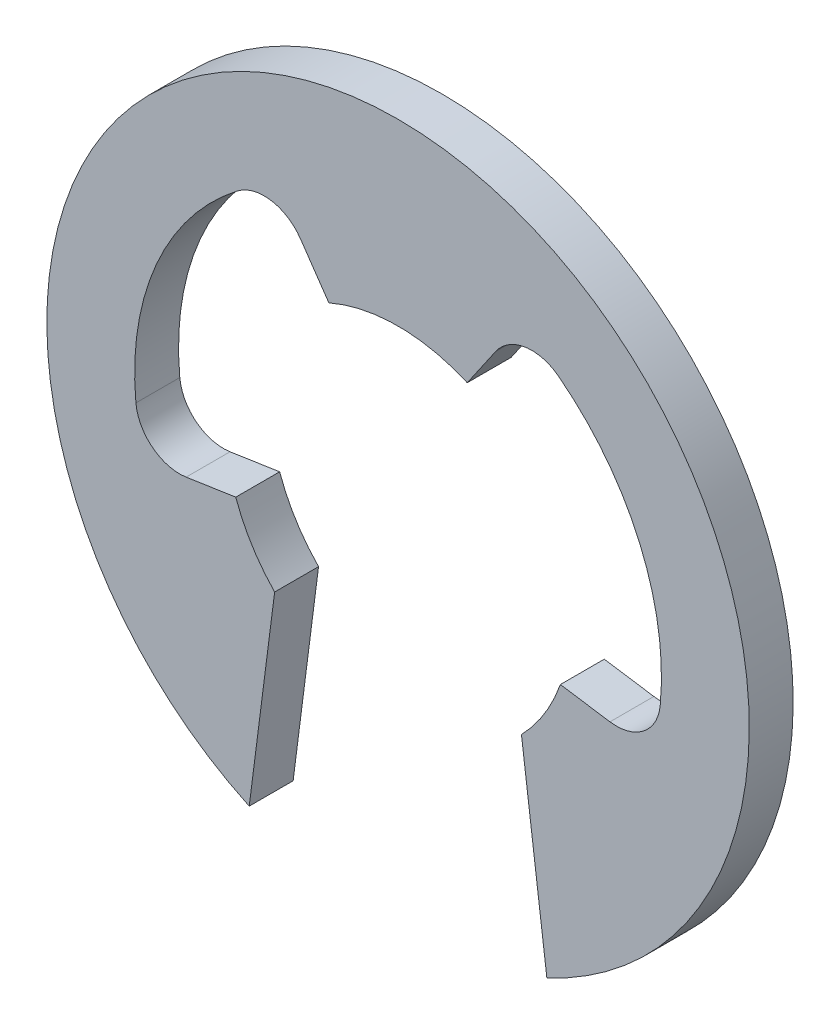
ISO-10303-21;
HEADER;
FILE_DESCRIPTION(('STEP AP214'),'2;1');
FILE_NAME('part.step','',(''),(''),'','','');
FILE_SCHEMA(('AUTOMOTIVE_DESIGN { 1 0 10303 214 1 1 1 1 }'));
ENDSEC;
DATA;
#1=APPLICATION_CONTEXT('core data for automotive mechanical design processes');
#2=APPLICATION_PROTOCOL_DEFINITION('international standard','automotive_design',2000,#1);
#3=PRODUCT_CONTEXT('',#1,'mechanical');
#4=PRODUCT('Part','Part','',(#3));
#5=PRODUCT_RELATED_PRODUCT_CATEGORY('part','',(#4));
#6=PRODUCT_DEFINITION_FORMATION('','',#4);
#7=PRODUCT_DEFINITION_CONTEXT('part definition',#1,'design');
#8=PRODUCT_DEFINITION('design','',#6,#7);
#9=PRODUCT_DEFINITION_SHAPE('','',#8);
#10=(LENGTH_UNIT() NAMED_UNIT(*) SI_UNIT(.MILLI.,.METRE.));
#11=(NAMED_UNIT(*) PLANE_ANGLE_UNIT() SI_UNIT($,.RADIAN.));
#12=(NAMED_UNIT(*) SI_UNIT($,.STERADIAN.) SOLID_ANGLE_UNIT());
#13=UNCERTAINTY_MEASURE_WITH_UNIT(LENGTH_MEASURE(1.E-05),#10,'distance_accuracy_value','');
#14=(GEOMETRIC_REPRESENTATION_CONTEXT(3) GLOBAL_UNCERTAINTY_ASSIGNED_CONTEXT((#13)) GLOBAL_UNIT_ASSIGNED_CONTEXT((#10,
#11,#12)) REPRESENTATION_CONTEXT('',''));
#15=CARTESIAN_POINT('',(0.,0.,0.));
#16=DIRECTION('',(0.,0.,1.));
#17=DIRECTION('',(1.,0.,0.));
#18=AXIS2_PLACEMENT_3D('',#15,#16,#17);
#19=CARTESIAN_POINT('',(0.,0.,0.634999999999997));
#20=DIRECTION('',(0.,0.,1.));
#21=DIRECTION('',(1.,0.,0.));
#22=AXIS2_PLACEMENT_3D('',#19,#20,#21);
#23=PLANE('',#22);
#24=CARTESIAN_POINT('',(0.,0.,0.63499999999999));
#25=DIRECTION('',(0.,0.,-1.));
#26=DIRECTION('',(-1.,0.,0.));
#27=AXIS2_PLACEMENT_3D('',#24,#25,#26);
#28=CIRCLE('',#27,2.4892);
#29=CARTESIAN_POINT('',(2.34754401776717,-0.827740131107426,0.63499999999999));
#30=VERTEX_POINT('',#29);
#31=CARTESIAN_POINT('',(1.78496345005559,-1.73494153272244,0.635));
#32=VERTEX_POINT('',#31);
#33=EDGE_CURVE('E205',#30,#32,#28,.T.);
#34=ORIENTED_EDGE('',*,*,#33,.T.);
#35=DIRECTION('',(-0.127237776683912,0.991872243882515,0.));
#36=VECTOR('',#35,1.);
#37=CARTESIAN_POINT('',(1.78496345005548,-1.73494153272161,0.635000000000011));
#38=LINE('',#37,#36);
#39=CARTESIAN_POINT('',(2.15266751005088,-4.60135008352677,0.634999999999997));
#40=VERTEX_POINT('',#39);
#41=EDGE_CURVE('E156',#32,#40,#38,.F.);
#42=ORIENTED_EDGE('',*,*,#41,.T.);
#43=CARTESIAN_POINT('',(0.,0.,0.634999999999997));
#44=DIRECTION('',(0.,0.,-1.));
#45=DIRECTION('',(-1.,0.,0.));
#46=AXIS2_PLACEMENT_3D('',#43,#44,#45);
#47=CIRCLE('',#46,5.08);
#48=CARTESIAN_POINT('',(-2.15266751005091,-4.60135008352674,0.634999999999997));
#49=VERTEX_POINT('',#48);
#50=EDGE_CURVE('E159',#49,#40,#47,.T.);
#51=ORIENTED_EDGE('',*,*,#50,.F.);
#52=DIRECTION('',(-0.127237776683909,-0.991872243882515,0.));
#53=VECTOR('',#52,1.);
#54=CARTESIAN_POINT('',(-1.78496345005572,-1.734941532722,0.634999999999997));
#55=LINE('',#54,#53);
#56=CARTESIAN_POINT('',(-1.78496345005588,-1.73494153272227,0.63499999999999));
#57=VERTEX_POINT('',#56);
#58=EDGE_CURVE('E131',#49,#57,#55,.F.);
#59=ORIENTED_EDGE('',*,*,#58,.T.);
#60=CARTESIAN_POINT('',(0.,0.,0.63499999999999));
#61=DIRECTION('',(0.,0.,-1.));
#62=DIRECTION('',(-1.,0.,0.));
#63=AXIS2_PLACEMENT_3D('',#60,#61,#62);
#64=CIRCLE('',#63,2.4892);
#65=CARTESIAN_POINT('',(-2.34754401776721,-0.827740131107244,0.634999999999983));
#66=VERTEX_POINT('',#65);
#67=EDGE_CURVE('E19',#57,#66,#64,.T.);
#68=ORIENTED_EDGE('',*,*,#67,.T.);
#69=DIRECTION('',(0.988814653958378,0.149149522685036,0.));
#70=VECTOR('',#69,1.);
#71=CARTESIAN_POINT('',(-2.34754401776721,-0.827740131107244,0.634999999999976));
#72=LINE('',#71,#70);
#73=CARTESIAN_POINT('',(-3.06530504624335,-0.936004823960085,0.635000000000004));
#74=VERTEX_POINT('',#73);
#75=EDGE_CURVE('E127',#66,#74,#72,.F.);
#76=ORIENTED_EDGE('',*,*,#75,.T.);
#77=CARTESIAN_POINT('',(-3.16001499314844,-0.308107518696588,0.635000000000004));
#78=DIRECTION('',(0.,0.,-1.));
#79=DIRECTION('',(-1.,0.,0.));
#80=AXIS2_PLACEMENT_3D('',#77,#78,#79);
#81=CIRCLE('',#80,0.634999999999999);
#82=CARTESIAN_POINT('',(-3.79201799177811,-0.36972902243569,0.634999999999998));
#83=VERTEX_POINT('',#82);
#84=EDGE_CURVE('E222',#74,#83,#81,.T.);
#85=ORIENTED_EDGE('',*,*,#84,.T.);
#86=CARTESIAN_POINT('',(0.,0.,0.634999999999997));
#87=DIRECTION('',(0.,0.,-1.));
#88=DIRECTION('',(-1.,0.,0.));
#89=AXIS2_PLACEMENT_3D('',#86,#87,#88);
#90=CIRCLE('',#89,3.81);
#91=CARTESIAN_POINT('',(-2.32237218816623,3.02037868811745,0.63499999999998));
#92=VERTEX_POINT('',#91);
#93=EDGE_CURVE('E220',#83,#92,#90,.T.);
#94=ORIENTED_EDGE('',*,*,#93,.T.);
#95=CARTESIAN_POINT('',(-1.93531015680536,2.51698224009822,0.634999999999969));
#96=DIRECTION('',(0.,0.,-1.));
#97=DIRECTION('',(-1.,0.,0.));
#98=AXIS2_PLACEMENT_3D('',#95,#96,#97);
#99=CIRCLE('',#98,0.634999999999999);
#100=CARTESIAN_POINT('',(-1.41229103578342,2.87708777885732,0.634999999999972));
#101=VERTEX_POINT('',#100);
#102=EDGE_CURVE('E217',#92,#101,#99,.T.);
#103=ORIENTED_EDGE('',*,*,#102,.T.);
#104=DIRECTION('',(-0.567095336629126,0.823652159089927,0.));
#105=VECTOR('',#104,1.);
#106=CARTESIAN_POINT('',(-1.00064773090945,2.27921494348944,0.634999999999976));
#107=LINE('',#106,#105);
#108=CARTESIAN_POINT('',(-1.00064773090946,2.27921494348943,0.635000000000011));
#109=VERTEX_POINT('',#108);
#110=EDGE_CURVE('E169',#101,#109,#107,.F.);
#111=ORIENTED_EDGE('',*,*,#110,.T.);
#112=CARTESIAN_POINT('',(0.,0.,0.635000000000011));
#113=DIRECTION('',(0.,0.,-1.));
#114=DIRECTION('',(-1.,0.,0.));
#115=AXIS2_PLACEMENT_3D('',#112,#113,#114);
#116=CIRCLE('',#115,2.4892);
#117=CARTESIAN_POINT('',(1.00064773090946,2.27921494348943,0.635));
#118=VERTEX_POINT('',#117);
#119=EDGE_CURVE('E215',#109,#118,#116,.T.);
#120=ORIENTED_EDGE('',*,*,#119,.T.);
#121=DIRECTION('',(-0.567095336629125,-0.823652159089928,0.));
#122=VECTOR('',#121,1.);
#123=CARTESIAN_POINT('',(1.00064773090947,2.27921494348946,0.63499999999999));
#124=LINE('',#123,#122);
#125=CARTESIAN_POINT('',(1.41229103578335,2.87708777885722,0.634999999999997));
#126=VERTEX_POINT('',#125);
#127=EDGE_CURVE('E165',#118,#126,#124,.F.);
#128=ORIENTED_EDGE('',*,*,#127,.T.);
#129=CARTESIAN_POINT('',(1.93531015680524,2.51698224009743,0.634999999999997));
#130=DIRECTION('',(0.,0.,-1.));
#131=DIRECTION('',(-1.,0.,0.));
#132=AXIS2_PLACEMENT_3D('',#129,#130,#131);
#133=CIRCLE('',#132,0.634999999999999);
#134=CARTESIAN_POINT('',(2.32237218816609,3.02037868811714,0.634999999999966));
#135=VERTEX_POINT('',#134);
#136=EDGE_CURVE('E213',#126,#135,#133,.T.);
#137=ORIENTED_EDGE('',*,*,#136,.T.);
#138=CARTESIAN_POINT('',(0.,0.,0.63499999999992));
#139=DIRECTION('',(0.,0.,-1.));
#140=DIRECTION('',(-1.,0.,0.));
#141=AXIS2_PLACEMENT_3D('',#138,#139,#140);
#142=CIRCLE('',#141,3.81);
#143=CARTESIAN_POINT('',(3.7920179917781,-0.369729022435736,0.634999999999895));
#144=VERTEX_POINT('',#143);
#145=EDGE_CURVE('E210',#135,#144,#142,.T.);
#146=ORIENTED_EDGE('',*,*,#145,.T.);
#147=CARTESIAN_POINT('',(3.16001499314843,-0.308107518696352,0.634999999999879));
#148=DIRECTION('',(0.,0.,-1.));
#149=DIRECTION('',(-1.,0.,0.));
#150=AXIS2_PLACEMENT_3D('',#147,#148,#149);
#151=CIRCLE('',#150,0.634999999999999);
#152=CARTESIAN_POINT('',(3.06530504624333,-0.936004823960258,0.634999999999941));
#153=VERTEX_POINT('',#152);
#154=EDGE_CURVE('E207',#144,#153,#151,.T.);
#155=ORIENTED_EDGE('',*,*,#154,.T.);
#156=DIRECTION('',(0.988814653958377,-0.149149522685037,0.));
#157=VECTOR('',#156,1.);
#158=CARTESIAN_POINT('',(2.34754401776705,-0.827740131107452,0.635000000000004));
#159=LINE('',#158,#157);
#160=EDGE_CURVE('E161',#153,#30,#159,.F.);
#161=ORIENTED_EDGE('',*,*,#160,.T.);
#162=EDGE_LOOP('',(#34,#42,#51,#59,#68,#76,#85,#94,#103,#111,#120,#128,#137,#146,#155,#161));
#163=FACE_BOUND('',#162,.T.);
#164=ADVANCED_FACE('F16',(#163),#23,.T.);
#165=CARTESIAN_POINT('',(-1.78496345005572,-1.734941532722,0.63499999999999));
#166=DIRECTION('',(-0.991872243882515,0.127237776683909,0.));
#167=DIRECTION('',(-0.127237776683909,-0.991872243882515,0.));
#168=AXIS2_PLACEMENT_3D('',#165,#166,#167);
#169=PLANE('',#168);
#170=DIRECTION('',(0.,0.,-1.));
#171=VECTOR('',#170,1.);
#172=CARTESIAN_POINT('',(-1.78496345005599,-1.73494153272216,0.634999999999997));
#173=LINE('',#172,#171);
#174=CARTESIAN_POINT('',(-1.78496345005591,-1.73494153272223,0.));
#175=VERTEX_POINT('',#174);
#176=EDGE_CURVE('E136',#175,#57,#173,.F.);
#177=ORIENTED_EDGE('',*,*,#176,.T.);
#178=ORIENTED_EDGE('',*,*,#58,.F.);
#179=DIRECTION('',(0.,0.,1.));
#180=VECTOR('',#179,1.);
#181=CARTESIAN_POINT('',(-2.15266751005091,-4.60135008352673,0.63499999999999));
#182=LINE('',#181,#180);
#183=CARTESIAN_POINT('',(-2.15266751005092,-4.60135008352673,0.));
#184=VERTEX_POINT('',#183);
#185=EDGE_CURVE('E153',#184,#49,#182,.T.);
#186=ORIENTED_EDGE('',*,*,#185,.F.);
#187=DIRECTION('',(0.12723777668389,0.991872243882518,0.));
#188=VECTOR('',#187,1.);
#189=CARTESIAN_POINT('',(-2.15266751005094,-4.60135008352673,0.));
#190=LINE('',#189,#188);
#191=EDGE_CURVE('E201',#184,#175,#190,.T.);
#192=ORIENTED_EDGE('',*,*,#191,.T.);
#193=EDGE_LOOP('',(#177,#178,#186,#192));
#194=FACE_BOUND('',#193,.T.);
#195=ADVANCED_FACE('F402',(#194),#169,.F.);
#196=CARTESIAN_POINT('',(0.,0.,0.634999999999997));
#197=DIRECTION('',(0.,0.,-1.));
#198=DIRECTION('',(-1.,0.,0.));
#199=AXIS2_PLACEMENT_3D('',#196,#197,#198);
#200=CYLINDRICAL_SURFACE('',#199,2.4892);
#201=DIRECTION('',(0.,0.,1.));
#202=VECTOR('',#201,1.);
#203=CARTESIAN_POINT('',(-2.34754401776723,-0.827740131107246,0.634999999999976));
#204=LINE('',#203,#202);
#205=CARTESIAN_POINT('',(-2.34754401776721,-0.827740131107242,0.));
#206=VERTEX_POINT('',#205);
#207=EDGE_CURVE('E135',#206,#66,#204,.T.);
#208=ORIENTED_EDGE('',*,*,#207,.T.);
#209=ORIENTED_EDGE('',*,*,#67,.F.);
#210=ORIENTED_EDGE('',*,*,#176,.F.);
#211=CARTESIAN_POINT('',(0.,0.,0.));
#212=DIRECTION('',(0.,0.,-1.));
#213=DIRECTION('',(-1.,0.,0.));
#214=AXIS2_PLACEMENT_3D('',#211,#212,#213);
#215=CIRCLE('',#214,2.4892);
#216=EDGE_CURVE('E147',#175,#206,#215,.T.);
#217=ORIENTED_EDGE('',*,*,#216,.T.);
#218=EDGE_LOOP('',(#208,#209,#210,#217));
#219=FACE_BOUND('',#218,.T.);
#220=ADVANCED_FACE('F145',(#219),#200,.F.);
#221=CARTESIAN_POINT('',(-2.34754401776721,-0.827740131107244,0.634999999999976));
#222=DIRECTION('',(0.149149522685036,-0.988814653958378,0.));
#223=DIRECTION('',(0.988814653958378,0.149149522685036,0.));
#224=AXIS2_PLACEMENT_3D('',#221,#222,#223);
#225=PLANE('',#224);
#226=DIRECTION('',(0.,0.,-1.));
#227=VECTOR('',#226,1.);
#228=CARTESIAN_POINT('',(-3.06530504624324,-0.936004823960126,0.635000000000004));
#229=LINE('',#228,#227);
#230=CARTESIAN_POINT('',(-3.06530504624359,-0.936004823959875,0.));
#231=VERTEX_POINT('',#230);
#232=EDGE_CURVE('E142',#231,#74,#229,.F.);
#233=ORIENTED_EDGE('',*,*,#232,.T.);
#234=ORIENTED_EDGE('',*,*,#75,.F.);
#235=ORIENTED_EDGE('',*,*,#207,.F.);
#236=DIRECTION('',(-0.988814653958478,-0.149149522684373,0.));
#237=VECTOR('',#236,1.);
#238=CARTESIAN_POINT('',(-2.34754401776723,-0.827740131107244,0.));
#239=LINE('',#238,#237);
#240=EDGE_CURVE('E199',#206,#231,#239,.T.);
#241=ORIENTED_EDGE('',*,*,#240,.T.);
#242=EDGE_LOOP('',(#233,#234,#235,#241));
#243=FACE_BOUND('',#242,.T.);
#244=ADVANCED_FACE('F139',(#243),#225,.F.);
#245=CARTESIAN_POINT('',(-3.16001499314844,-0.308107518696588,0.635000000000004));
#246=DIRECTION('',(0.,0.,-1.));
#247=DIRECTION('',(-1.,0.,0.));
#248=AXIS2_PLACEMENT_3D('',#245,#246,#247);
#249=CYLINDRICAL_SURFACE('',#248,0.634999999999999);
#250=DIRECTION('',(0.,0.,-1.));
#251=VECTOR('',#250,1.);
#252=CARTESIAN_POINT('',(-3.7920179917781,-0.369729022435484,0.634999999999997));
#253=LINE('',#252,#251);
#254=CARTESIAN_POINT('',(-3.79201799177808,-0.369729022435687,0.));
#255=VERTEX_POINT('',#254);
#256=EDGE_CURVE('E221',#255,#83,#253,.F.);
#257=ORIENTED_EDGE('',*,*,#256,.T.);
#258=ORIENTED_EDGE('',*,*,#84,.F.);
#259=ORIENTED_EDGE('',*,*,#232,.F.);
#260=CARTESIAN_POINT('',(-3.16001499314844,-0.308107518696588,0.));
#261=DIRECTION('',(0.,0.,-1.));
#262=DIRECTION('',(-1.,0.,0.));
#263=AXIS2_PLACEMENT_3D('',#260,#261,#262);
#264=CIRCLE('',#263,0.634999999999999);
#265=EDGE_CURVE('E196',#231,#255,#264,.T.);
#266=ORIENTED_EDGE('',*,*,#265,.T.);
#267=EDGE_LOOP('',(#257,#258,#259,#266));
#268=FACE_BOUND('',#267,.T.);
#269=ADVANCED_FACE('F294',(#268),#249,.F.);
#270=CARTESIAN_POINT('',(0.,0.,0.634999999999997));
#271=DIRECTION('',(0.,0.,-1.));
#272=DIRECTION('',(-1.,0.,0.));
#273=AXIS2_PLACEMENT_3D('',#270,#271,#272);
#274=CYLINDRICAL_SURFACE('',#273,3.81);
#275=ORIENTED_EDGE('',*,*,#93,.F.);
#276=ORIENTED_EDGE('',*,*,#256,.F.);
#277=CARTESIAN_POINT('',(0.,0.,0.));
#278=DIRECTION('',(0.,0.,-1.));
#279=DIRECTION('',(-1.,0.,0.));
#280=AXIS2_PLACEMENT_3D('',#277,#278,#279);
#281=CIRCLE('',#280,3.81);
#282=CARTESIAN_POINT('',(-2.32237218816643,3.02037868811771,0.));
#283=VERTEX_POINT('',#282);
#284=EDGE_CURVE('E194',#255,#283,#281,.T.);
#285=ORIENTED_EDGE('',*,*,#284,.T.);
#286=DIRECTION('',(0.,0.,-1.));
#287=VECTOR('',#286,1.);
#288=CARTESIAN_POINT('',(-2.32237218816651,3.02037868811765,0.634999999999879));
#289=LINE('',#288,#287);
#290=EDGE_CURVE('E219',#283,#92,#289,.F.);
#291=ORIENTED_EDGE('',*,*,#290,.T.);
#292=EDGE_LOOP('',(#275,#276,#285,#291));
#293=FACE_BOUND('',#292,.T.);
#294=ADVANCED_FACE('F292',(#293),#274,.F.);
#295=CARTESIAN_POINT('',(-1.93531015680536,2.51698224009822,0.634999999999879));
#296=DIRECTION('',(0.,0.,-1.));
#297=DIRECTION('',(-1.,0.,0.));
#298=AXIS2_PLACEMENT_3D('',#295,#296,#297);
#299=CYLINDRICAL_SURFACE('',#298,0.634999999999999);
#300=DIRECTION('',(0.,0.,1.));
#301=VECTOR('',#300,1.);
#302=CARTESIAN_POINT('',(-1.41229103578328,2.87708777885712,0.635000000000011));
#303=LINE('',#302,#301);
#304=CARTESIAN_POINT('',(-1.41229103578337,2.8770877788573,0.));
#305=VERTEX_POINT('',#304);
#306=EDGE_CURVE('E171',#305,#101,#303,.T.);
#307=ORIENTED_EDGE('',*,*,#306,.T.);
#308=ORIENTED_EDGE('',*,*,#102,.F.);
#309=ORIENTED_EDGE('',*,*,#290,.F.);
#310=CARTESIAN_POINT('',(-1.93531015680536,2.51698224009822,0.));
#311=DIRECTION('',(0.,0.,-1.));
#312=DIRECTION('',(-1.,0.,0.));
#313=AXIS2_PLACEMENT_3D('',#310,#311,#312);
#314=CIRCLE('',#313,0.634999999999999);
#315=EDGE_CURVE('E191',#283,#305,#314,.T.);
#316=ORIENTED_EDGE('',*,*,#315,.T.);
#317=EDGE_LOOP('',(#307,#308,#309,#316));
#318=FACE_BOUND('',#317,.T.);
#319=ADVANCED_FACE('F289',(#318),#299,.F.);
#320=CARTESIAN_POINT('',(-1.00064773090945,2.27921494348944,0.635000000000011));
#321=DIRECTION('',(0.823652159089927,0.567095336629126,0.));
#322=DIRECTION('',(-0.567095336629126,0.823652159089927,0.));
#323=AXIS2_PLACEMENT_3D('',#320,#321,#322);
#324=PLANE('',#323);
#325=DIRECTION('',(0.,0.,-1.));
#326=VECTOR('',#325,1.);
#327=CARTESIAN_POINT('',(-1.00064773090948,2.27921494348942,0.634999999999997));
#328=LINE('',#327,#326);
#329=CARTESIAN_POINT('',(-1.00064773090948,2.27921494348942,0.));
#330=VERTEX_POINT('',#329);
#331=EDGE_CURVE('E170',#330,#109,#328,.F.);
#332=ORIENTED_EDGE('',*,*,#331,.T.);
#333=ORIENTED_EDGE('',*,*,#110,.F.);
#334=ORIENTED_EDGE('',*,*,#306,.F.);
#335=DIRECTION('',(0.56709533662902,-0.82365215909,0.));
#336=VECTOR('',#335,1.);
#337=CARTESIAN_POINT('',(-1.41229103578323,2.87708777885716,0.));
#338=LINE('',#337,#336);
#339=EDGE_CURVE('E190',#305,#330,#338,.T.);
#340=ORIENTED_EDGE('',*,*,#339,.T.);
#341=EDGE_LOOP('',(#332,#333,#334,#340));
#342=FACE_BOUND('',#341,.T.);
#343=ADVANCED_FACE('F284',(#342),#324,.F.);
#344=CARTESIAN_POINT('',(0.,0.,0.634999999999997));
#345=DIRECTION('',(0.,0.,-1.));
#346=DIRECTION('',(-1.,0.,0.));
#347=AXIS2_PLACEMENT_3D('',#344,#345,#346);
#348=CYLINDRICAL_SURFACE('',#347,2.4892);
#349=DIRECTION('',(0.,0.,1.));
#350=VECTOR('',#349,1.);
#351=CARTESIAN_POINT('',(1.00064773090945,2.27921494348942,0.63499999999999));
#352=LINE('',#351,#350);
#353=CARTESIAN_POINT('',(1.0006477309094,2.27921494348946,0.));
#354=VERTEX_POINT('',#353);
#355=EDGE_CURVE('E168',#354,#118,#352,.T.);
#356=ORIENTED_EDGE('',*,*,#355,.T.);
#357=ORIENTED_EDGE('',*,*,#119,.F.);
#358=ORIENTED_EDGE('',*,*,#331,.F.);
#359=CARTESIAN_POINT('',(0.,0.,0.));
#360=DIRECTION('',(0.,0.,-1.));
#361=DIRECTION('',(-1.,0.,0.));
#362=AXIS2_PLACEMENT_3D('',#359,#360,#361);
#363=CIRCLE('',#362,2.4892);
#364=EDGE_CURVE('E187',#330,#354,#363,.T.);
#365=ORIENTED_EDGE('',*,*,#364,.T.);
#366=EDGE_LOOP('',(#356,#357,#358,#365));
#367=FACE_BOUND('',#366,.T.);
#368=ADVANCED_FACE('F280',(#367),#348,.F.);
#369=CARTESIAN_POINT('',(1.00064773090947,2.27921494348946,0.63499999999999));
#370=DIRECTION('',(-0.823652159089928,0.567095336629125,0.));
#371=DIRECTION('',(-0.567095336629125,-0.823652159089928,0.));
#372=AXIS2_PLACEMENT_3D('',#369,#370,#371);
#373=PLANE('',#372);
#374=DIRECTION('',(0.,0.,-1.));
#375=VECTOR('',#374,1.);
#376=CARTESIAN_POINT('',(1.41229103578355,2.87708777885753,0.634999999999997));
#377=LINE('',#376,#375);
#378=CARTESIAN_POINT('',(1.41229103578324,2.87708777885725,0.));
#379=VERTEX_POINT('',#378);
#380=EDGE_CURVE('E167',#379,#126,#377,.F.);
#381=ORIENTED_EDGE('',*,*,#380,.T.);
#382=ORIENTED_EDGE('',*,*,#127,.F.);
#383=ORIENTED_EDGE('',*,*,#355,.F.);
#384=DIRECTION('',(0.567095336629031,0.823652159089992,0.));
#385=VECTOR('',#384,1.);
#386=CARTESIAN_POINT('',(1.00064773090934,2.2792149434895,0.));
#387=LINE('',#386,#385);
#388=EDGE_CURVE('E186',#354,#379,#387,.T.);
#389=ORIENTED_EDGE('',*,*,#388,.T.);
#390=EDGE_LOOP('',(#381,#382,#383,#389));
#391=FACE_BOUND('',#390,.T.);
#392=ADVANCED_FACE('F276',(#391),#373,.F.);
#393=CARTESIAN_POINT('',(1.93531015680524,2.51698224009743,0.634999999999997));
#394=DIRECTION('',(0.,0.,-1.));
#395=DIRECTION('',(-1.,0.,0.));
#396=AXIS2_PLACEMENT_3D('',#393,#394,#395);
#397=CYLINDRICAL_SURFACE('',#396,0.634999999999999);
#398=DIRECTION('',(0.,0.,-1.));
#399=VECTOR('',#398,1.);
#400=CARTESIAN_POINT('',(2.32237218816588,3.02037868811734,0.634999999999997));
#401=LINE('',#400,#399);
#402=CARTESIAN_POINT('',(2.32237218816611,3.02037868811717,0.));
#403=VERTEX_POINT('',#402);
#404=EDGE_CURVE('E212',#403,#135,#401,.F.);
#405=ORIENTED_EDGE('',*,*,#404,.T.);
#406=ORIENTED_EDGE('',*,*,#136,.F.);
#407=ORIENTED_EDGE('',*,*,#380,.F.);
#408=CARTESIAN_POINT('',(1.93531015680524,2.51698224009743,0.));
#409=DIRECTION('',(0.,0.,-1.));
#410=DIRECTION('',(-1.,0.,0.));
#411=AXIS2_PLACEMENT_3D('',#408,#409,#410);
#412=CIRCLE('',#411,0.634999999999999);
#413=EDGE_CURVE('E183',#379,#403,#412,.T.);
#414=ORIENTED_EDGE('',*,*,#413,.T.);
#415=EDGE_LOOP('',(#405,#406,#407,#414));
#416=FACE_BOUND('',#415,.T.);
#417=ADVANCED_FACE('F272',(#416),#397,.F.);
#418=CARTESIAN_POINT('',(0.,0.,0.634999999999997));
#419=DIRECTION('',(0.,0.,-1.));
#420=DIRECTION('',(-1.,0.,0.));
#421=AXIS2_PLACEMENT_3D('',#418,#419,#420);
#422=CYLINDRICAL_SURFACE('',#421,3.81);
#423=DIRECTION('',(0.,0.,-1.));
#424=VECTOR('',#423,1.);
#425=CARTESIAN_POINT('',(3.79201799177809,-0.369729022435857,0.634999999999976));
#426=LINE('',#425,#424);
#427=CARTESIAN_POINT('',(3.7920179917781,-0.369729022435736,0.));
#428=VERTEX_POINT('',#427);
#429=EDGE_CURVE('E209',#428,#144,#426,.F.);
#430=ORIENTED_EDGE('',*,*,#429,.T.);
#431=ORIENTED_EDGE('',*,*,#145,.F.);
#432=ORIENTED_EDGE('',*,*,#404,.F.);
#433=CARTESIAN_POINT('',(0.,0.,-1.2490009027033E-13));
#434=DIRECTION('',(0.,0.,-1.));
#435=DIRECTION('',(-1.,0.,0.));
#436=AXIS2_PLACEMENT_3D('',#433,#434,#435);
#437=CIRCLE('',#436,3.81);
#438=EDGE_CURVE('E180',#403,#428,#437,.T.);
#439=ORIENTED_EDGE('',*,*,#438,.T.);
#440=EDGE_LOOP('',(#430,#431,#432,#439));
#441=FACE_BOUND('',#440,.T.);
#442=ADVANCED_FACE('F268',(#441),#422,.F.);
#443=CARTESIAN_POINT('',(3.16001499314843,-0.308107518696352,0.634999999999976));
#444=DIRECTION('',(0.,0.,-1.));
#445=DIRECTION('',(-1.,0.,0.));
#446=AXIS2_PLACEMENT_3D('',#443,#444,#445);
#447=CYLINDRICAL_SURFACE('',#446,0.634999999999999);
#448=DIRECTION('',(0.,0.,1.));
#449=VECTOR('',#448,1.);
#450=CARTESIAN_POINT('',(3.06530504624328,-0.93600482396025,0.63499999999999));
#451=LINE('',#450,#449);
#452=CARTESIAN_POINT('',(3.06530504624343,-0.936004823960125,0.));
#453=VERTEX_POINT('',#452);
#454=EDGE_CURVE('E164',#453,#153,#451,.T.);
#455=ORIENTED_EDGE('',*,*,#454,.T.);
#456=ORIENTED_EDGE('',*,*,#154,.F.);
#457=ORIENTED_EDGE('',*,*,#429,.F.);
#458=CARTESIAN_POINT('',(3.16001499314843,-0.308107518696352,0.));
#459=DIRECTION('',(0.,0.,-1.));
#460=DIRECTION('',(-1.,0.,0.));
#461=AXIS2_PLACEMENT_3D('',#458,#459,#460);
#462=CIRCLE('',#461,0.634999999999999);
#463=EDGE_CURVE('E177',#428,#453,#462,.T.);
#464=ORIENTED_EDGE('',*,*,#463,.T.);
#465=EDGE_LOOP('',(#455,#456,#457,#464));
#466=FACE_BOUND('',#465,.T.);
#467=ADVANCED_FACE('F264',(#466),#447,.F.);
#468=CARTESIAN_POINT('',(2.34754401776705,-0.827740131107452,0.63499999999999));
#469=DIRECTION('',(-0.149149522685037,-0.988814653958377,0.));
#470=DIRECTION('',(0.988814653958377,-0.149149522685037,0.));
#471=AXIS2_PLACEMENT_3D('',#468,#469,#470);
#472=PLANE('',#471);
#473=DIRECTION('',(0.,0.,-1.));
#474=VECTOR('',#473,1.);
#475=CARTESIAN_POINT('',(2.34754401776718,-0.827740131107385,0.634999999999997));
#476=LINE('',#475,#474);
#477=CARTESIAN_POINT('',(2.34754401776718,-0.827740131107377,0.));
#478=VERTEX_POINT('',#477);
#479=EDGE_CURVE('E163',#478,#30,#476,.F.);
#480=ORIENTED_EDGE('',*,*,#479,.T.);
#481=ORIENTED_EDGE('',*,*,#160,.F.);
#482=ORIENTED_EDGE('',*,*,#454,.F.);
#483=DIRECTION('',(-0.988814653958417,0.149149522684776,0.));
#484=VECTOR('',#483,1.);
#485=CARTESIAN_POINT('',(3.06530504624332,-0.93600482395996,0.));
#486=LINE('',#485,#484);
#487=EDGE_CURVE('E176',#453,#478,#486,.T.);
#488=ORIENTED_EDGE('',*,*,#487,.T.);
#489=EDGE_LOOP('',(#480,#481,#482,#488));
#490=FACE_BOUND('',#489,.T.);
#491=ADVANCED_FACE('F257',(#490),#472,.F.);
#492=CARTESIAN_POINT('',(0.,0.,0.634999999999997));
#493=DIRECTION('',(0.,0.,-1.));
#494=DIRECTION('',(-1.,0.,0.));
#495=AXIS2_PLACEMENT_3D('',#492,#493,#494);
#496=CYLINDRICAL_SURFACE('',#495,2.4892);
#497=DIRECTION('',(0.,0.,1.));
#498=VECTOR('',#497,1.);
#499=CARTESIAN_POINT('',(1.78496345005557,-1.73494153272229,0.635000000000011));
#500=LINE('',#499,#498);
#501=CARTESIAN_POINT('',(1.7849634500556,-1.73494153272243,0.));
#502=VERTEX_POINT('',#501);
#503=EDGE_CURVE('E160',#502,#32,#500,.T.);
#504=ORIENTED_EDGE('',*,*,#503,.T.);
#505=ORIENTED_EDGE('',*,*,#33,.F.);
#506=ORIENTED_EDGE('',*,*,#479,.F.);
#507=CARTESIAN_POINT('',(0.,0.,0.));
#508=DIRECTION('',(0.,0.,-1.));
#509=DIRECTION('',(-1.,0.,0.));
#510=AXIS2_PLACEMENT_3D('',#507,#508,#509);
#511=CIRCLE('',#510,2.4892);
#512=EDGE_CURVE('E25',#478,#502,#511,.T.);
#513=ORIENTED_EDGE('',*,*,#512,.T.);
#514=EDGE_LOOP('',(#504,#505,#506,#513));
#515=FACE_BOUND('',#514,.T.);
#516=ADVANCED_FACE('F316',(#515),#496,.F.);
#517=CARTESIAN_POINT('',(1.78496345005548,-1.73494153272161,0.635000000000011));
#518=DIRECTION('',(0.991872243882515,0.127237776683912,0.));
#519=DIRECTION('',(-0.127237776683912,0.991872243882515,0.));
#520=AXIS2_PLACEMENT_3D('',#517,#518,#519);
#521=PLANE('',#520);
#522=DIRECTION('',(0.,0.,-1.));
#523=VECTOR('',#522,1.);
#524=CARTESIAN_POINT('',(2.15266751005101,-4.60135008352671,0.634999999999997));
#525=LINE('',#524,#523);
#526=CARTESIAN_POINT('',(2.15266751005093,-4.60135008352675,-1.2490009027033E-13));
#527=VERTEX_POINT('',#526);
#528=EDGE_CURVE('E203',#40,#527,#525,.T.);
#529=ORIENTED_EDGE('',*,*,#528,.F.);
#530=ORIENTED_EDGE('',*,*,#41,.F.);
#531=ORIENTED_EDGE('',*,*,#503,.F.);
#532=DIRECTION('',(0.127237776683939,-0.991872243882511,0.));
#533=VECTOR('',#532,1.);
#534=CARTESIAN_POINT('',(1.78496345005559,-1.73494153272229,0.));
#535=LINE('',#534,#533);
#536=EDGE_CURVE('E11',#502,#527,#535,.T.);
#537=ORIENTED_EDGE('',*,*,#536,.T.);
#538=EDGE_LOOP('',(#529,#530,#531,#537));
#539=FACE_BOUND('',#538,.T.);
#540=ADVANCED_FACE('F310',(#539),#521,.F.);
#541=CARTESIAN_POINT('',(0.,0.,0.634999999999997));
#542=DIRECTION('',(0.,0.,-1.));
#543=DIRECTION('',(-1.,0.,0.));
#544=AXIS2_PLACEMENT_3D('',#541,#542,#543);
#545=CYLINDRICAL_SURFACE('',#544,5.08);
#546=ORIENTED_EDGE('',*,*,#528,.T.);
#547=CARTESIAN_POINT('',(0.,0.,0.));
#548=DIRECTION('',(0.,0.,-1.));
#549=DIRECTION('',(-1.,0.,0.));
#550=AXIS2_PLACEMENT_3D('',#547,#548,#549);
#551=CIRCLE('',#550,5.08);
#552=EDGE_CURVE('E34',#527,#184,#551,.F.);
#553=ORIENTED_EDGE('',*,*,#552,.T.);
#554=ORIENTED_EDGE('',*,*,#185,.T.);
#555=ORIENTED_EDGE('',*,*,#50,.T.);
#556=EDGE_LOOP('',(#546,#553,#554,#555));
#557=FACE_BOUND('',#556,.T.);
#558=ADVANCED_FACE('F305',(#557),#545,.T.);
#559=CARTESIAN_POINT('',(0.,0.,0.));
#560=DIRECTION('',(0.,0.,1.));
#561=DIRECTION('',(1.,0.,0.));
#562=AXIS2_PLACEMENT_3D('',#559,#560,#561);
#563=PLANE('',#562);
#564=ORIENTED_EDGE('',*,*,#536,.F.);
#565=ORIENTED_EDGE('',*,*,#512,.F.);
#566=ORIENTED_EDGE('',*,*,#487,.F.);
#567=ORIENTED_EDGE('',*,*,#463,.F.);
#568=ORIENTED_EDGE('',*,*,#438,.F.);
#569=ORIENTED_EDGE('',*,*,#413,.F.);
#570=ORIENTED_EDGE('',*,*,#388,.F.);
#571=ORIENTED_EDGE('',*,*,#364,.F.);
#572=ORIENTED_EDGE('',*,*,#339,.F.);
#573=ORIENTED_EDGE('',*,*,#315,.F.);
#574=ORIENTED_EDGE('',*,*,#284,.F.);
#575=ORIENTED_EDGE('',*,*,#265,.F.);
#576=ORIENTED_EDGE('',*,*,#240,.F.);
#577=ORIENTED_EDGE('',*,*,#216,.F.);
#578=ORIENTED_EDGE('',*,*,#191,.F.);
#579=ORIENTED_EDGE('',*,*,#552,.F.);
#580=EDGE_LOOP('',(#564,#565,#566,#567,#568,#569,#570,#571,#572,#573,#574,#575,#576,#577,#578,#579));
#581=FACE_BOUND('',#580,.T.);
#582=ADVANCED_FACE('F261',(#581),#563,.F.);
#583=CLOSED_SHELL('',(#164,#195,#220,#244,#269,#294,#319,#343,#368,#392,#417,#442,#467,#491,
#516,#540,#558,#582));
#584=MANIFOLD_SOLID_BREP('B1',#583);
#585=ADVANCED_BREP_SHAPE_REPRESENTATION('',(#18,#584),#14);
#586=SHAPE_DEFINITION_REPRESENTATION(#9,#585);
ENDSEC;
END-ISO-10303-21;
